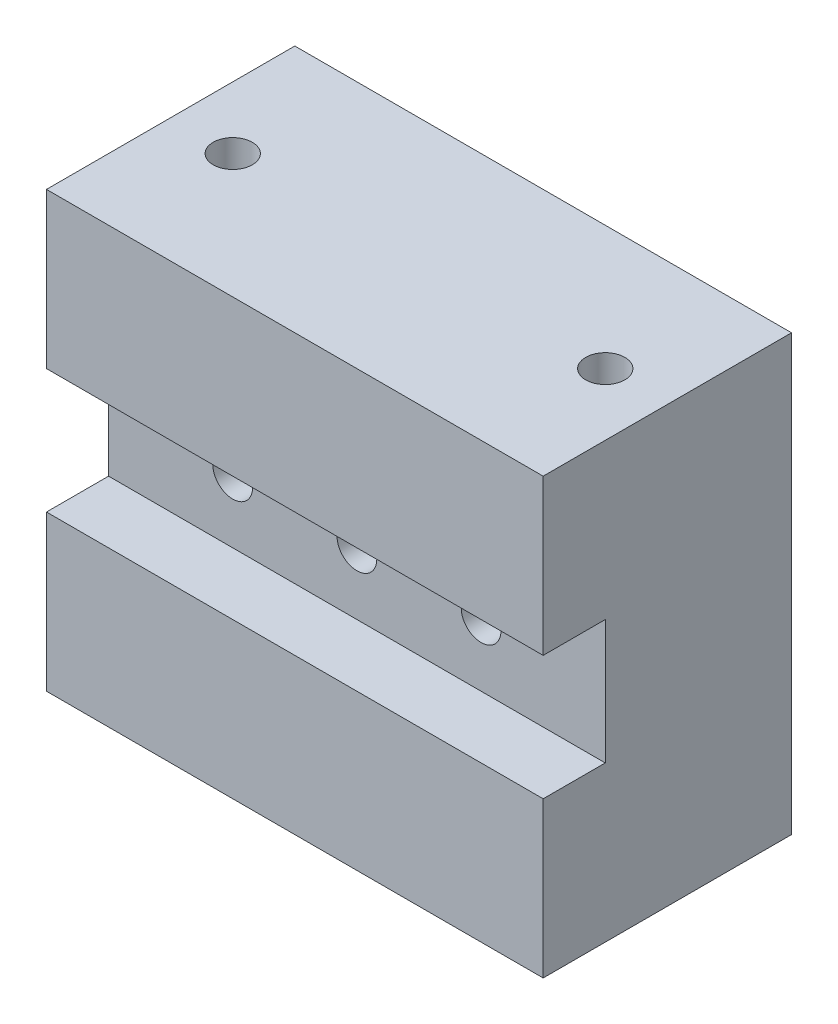
ISO-10303-21;
HEADER;
FILE_DESCRIPTION(('STEP AP214'),'2;1');
FILE_NAME('part.step','',(''),(''),'','','');
FILE_SCHEMA(('AUTOMOTIVE_DESIGN { 1 0 10303 214 1 1 1 1 }'));
ENDSEC;
DATA;
#1=APPLICATION_CONTEXT('core data for automotive mechanical design processes');
#2=APPLICATION_PROTOCOL_DEFINITION('international standard','automotive_design',2000,#1);
#3=PRODUCT_CONTEXT('',#1,'mechanical');
#4=PRODUCT('Part','Part','',(#3));
#5=PRODUCT_RELATED_PRODUCT_CATEGORY('part','',(#4));
#6=PRODUCT_DEFINITION_FORMATION('','',#4);
#7=PRODUCT_DEFINITION_CONTEXT('part definition',#1,'design');
#8=PRODUCT_DEFINITION('design','',#6,#7);
#9=PRODUCT_DEFINITION_SHAPE('','',#8);
#10=(LENGTH_UNIT() NAMED_UNIT(*) SI_UNIT(.MILLI.,.METRE.));
#11=(NAMED_UNIT(*) PLANE_ANGLE_UNIT() SI_UNIT($,.RADIAN.));
#12=(NAMED_UNIT(*) SI_UNIT($,.STERADIAN.) SOLID_ANGLE_UNIT());
#13=UNCERTAINTY_MEASURE_WITH_UNIT(LENGTH_MEASURE(1.E-05),#10,'distance_accuracy_value','');
#14=(GEOMETRIC_REPRESENTATION_CONTEXT(3) GLOBAL_UNCERTAINTY_ASSIGNED_CONTEXT((#13)) GLOBAL_UNIT_ASSIGNED_CONTEXT((#10,
#11,#12)) REPRESENTATION_CONTEXT('',''));
#15=CARTESIAN_POINT('',(0.,0.,0.));
#16=DIRECTION('',(0.,0.,1.));
#17=DIRECTION('',(1.,0.,0.));
#18=AXIS2_PLACEMENT_3D('',#15,#16,#17);
#19=CARTESIAN_POINT('',(0.,0.,25.4));
#20=DIRECTION('',(0.,0.,-1.));
#21=DIRECTION('',(-1.,0.,0.));
#22=AXIS2_PLACEMENT_3D('',#19,#20,#21);
#23=PLANE('',#22);
#24=DIRECTION('',(0.,-1.,0.));
#25=VECTOR('',#24,1.);
#26=CARTESIAN_POINT('',(0.,0.,25.4));
#27=LINE('',#26,#25);
#28=CARTESIAN_POINT('',(0.,44.45,25.4));
#29=VERTEX_POINT('',#28);
#30=CARTESIAN_POINT('',(0.,28.575,25.4));
#31=VERTEX_POINT('',#30);
#32=EDGE_CURVE('E148',#29,#31,#27,.T.);
#33=ORIENTED_EDGE('',*,*,#32,.T.);
#34=DIRECTION('',(-1.,0.,0.));
#35=VECTOR('',#34,1.);
#36=CARTESIAN_POINT('',(0.,28.575,25.4));
#37=LINE('',#36,#35);
#38=CARTESIAN_POINT('',(50.8,28.575,25.4));
#39=VERTEX_POINT('',#38);
#40=EDGE_CURVE('E125',#39,#31,#37,.T.);
#41=ORIENTED_EDGE('',*,*,#40,.F.);
#42=DIRECTION('',(0.,1.,0.));
#43=VECTOR('',#42,1.);
#44=CARTESIAN_POINT('',(50.8,0.,25.4));
#45=LINE('',#44,#43);
#46=CARTESIAN_POINT('',(50.8,44.45,25.4));
#47=VERTEX_POINT('',#46);
#48=EDGE_CURVE('E152',#39,#47,#45,.T.);
#49=ORIENTED_EDGE('',*,*,#48,.T.);
#50=DIRECTION('',(-1.,0.,0.));
#51=VECTOR('',#50,1.);
#52=CARTESIAN_POINT('',(0.,44.45,25.4));
#53=LINE('',#52,#51);
#54=EDGE_CURVE('E59',#47,#29,#53,.T.);
#55=ORIENTED_EDGE('',*,*,#54,.T.);
#56=EDGE_LOOP('',(#33,#41,#49,#55));
#57=FACE_BOUND('',#56,.T.);
#58=ADVANCED_FACE('F35',(#57),#23,.F.);
#59=CARTESIAN_POINT('',(0.,0.,25.4));
#60=DIRECTION('',(1.,0.,0.));
#61=DIRECTION('',(0.,0.,-1.));
#62=AXIS2_PLACEMENT_3D('',#59,#60,#61);
#63=PLANE('',#62);
#64=DIRECTION('',(0.,-1.,0.));
#65=VECTOR('',#64,1.);
#66=CARTESIAN_POINT('',(0.,15.875,19.05));
#67=LINE('',#66,#65);
#68=CARTESIAN_POINT('',(0.,28.575,19.05));
#69=VERTEX_POINT('',#68);
#70=CARTESIAN_POINT('',(0.,15.875,19.05));
#71=VERTEX_POINT('',#70);
#72=EDGE_CURVE('E116',#69,#71,#67,.T.);
#73=ORIENTED_EDGE('',*,*,#72,.F.);
#74=DIRECTION('',(0.,0.,1.));
#75=VECTOR('',#74,1.);
#76=CARTESIAN_POINT('',(0.,28.575,19.05));
#77=LINE('',#76,#75);
#78=EDGE_CURVE('E147',#69,#31,#77,.T.);
#79=ORIENTED_EDGE('',*,*,#78,.T.);
#80=ORIENTED_EDGE('',*,*,#32,.F.);
#81=DIRECTION('',(0.,0.,-1.));
#82=VECTOR('',#81,1.);
#83=CARTESIAN_POINT('',(0.,44.45,25.4));
#84=LINE('',#83,#82);
#85=CARTESIAN_POINT('',(0.,44.45,0.));
#86=VERTEX_POINT('',#85);
#87=EDGE_CURVE('E157',#29,#86,#84,.T.);
#88=ORIENTED_EDGE('',*,*,#87,.T.);
#89=DIRECTION('',(0.,-1.,0.));
#90=VECTOR('',#89,1.);
#91=CARTESIAN_POINT('',(0.,0.,0.));
#92=LINE('',#91,#90);
#93=CARTESIAN_POINT('',(0.,0.,0.));
#94=VERTEX_POINT('',#93);
#95=EDGE_CURVE('E137',#86,#94,#92,.T.);
#96=ORIENTED_EDGE('',*,*,#95,.T.);
#97=DIRECTION('',(0.,0.,-1.));
#98=VECTOR('',#97,1.);
#99=CARTESIAN_POINT('',(0.,0.,25.4));
#100=LINE('',#99,#98);
#101=CARTESIAN_POINT('',(0.,0.,25.4));
#102=VERTEX_POINT('',#101);
#103=EDGE_CURVE('E11',#102,#94,#100,.T.);
#104=ORIENTED_EDGE('',*,*,#103,.F.);
#105=CARTESIAN_POINT('',(0.,15.875,25.4));
#106=VERTEX_POINT('',#105);
#107=EDGE_CURVE('E87',#106,#102,#27,.T.);
#108=ORIENTED_EDGE('',*,*,#107,.F.);
#109=DIRECTION('',(0.,0.,1.));
#110=VECTOR('',#109,1.);
#111=CARTESIAN_POINT('',(0.,15.875,19.05));
#112=LINE('',#111,#110);
#113=EDGE_CURVE('E50',#71,#106,#112,.T.);
#114=ORIENTED_EDGE('',*,*,#113,.F.);
#115=EDGE_LOOP('',(#73,#79,#80,#88,#96,#104,#108,#114));
#116=FACE_BOUND('',#115,.T.);
#117=ADVANCED_FACE('F37',(#116),#63,.F.);
#118=CARTESIAN_POINT('',(0.,0.,25.4));
#119=DIRECTION('',(0.,1.,0.));
#120=DIRECTION('',(0.,0.,1.));
#121=AXIS2_PLACEMENT_3D('',#118,#119,#120);
#122=PLANE('',#121);
#123=CARTESIAN_POINT('',(6.35,0.,12.7));
#124=DIRECTION('',(0.,1.,0.));
#125=DIRECTION('',(0.,0.,1.));
#126=AXIS2_PLACEMENT_3D('',#123,#124,#125);
#127=CIRCLE('',#126,2.);
#128=CARTESIAN_POINT('',(6.35,0.,14.7));
#129=VERTEX_POINT('',#128);
#130=EDGE_CURVE('E134',#129,#129,#127,.T.);
#131=ORIENTED_EDGE('',*,*,#130,.T.);
#132=EDGE_LOOP('',(#131));
#133=FACE_BOUND('',#132,.T.);
#134=CARTESIAN_POINT('',(44.45,0.,12.7));
#135=DIRECTION('',(0.,1.,0.));
#136=DIRECTION('',(0.,0.,1.));
#137=AXIS2_PLACEMENT_3D('',#134,#135,#136);
#138=CIRCLE('',#137,2.);
#139=CARTESIAN_POINT('',(44.45,0.,14.7));
#140=VERTEX_POINT('',#139);
#141=EDGE_CURVE('E141',#140,#140,#138,.T.);
#142=ORIENTED_EDGE('',*,*,#141,.T.);
#143=EDGE_LOOP('',(#142));
#144=FACE_BOUND('',#143,.T.);
#145=DIRECTION('',(1.,0.,0.));
#146=VECTOR('',#145,1.);
#147=CARTESIAN_POINT('',(0.,0.,0.));
#148=LINE('',#147,#146);
#149=CARTESIAN_POINT('',(50.8,0.,0.));
#150=VERTEX_POINT('',#149);
#151=EDGE_CURVE('E160',#94,#150,#148,.T.);
#152=ORIENTED_EDGE('',*,*,#151,.T.);
#153=DIRECTION('',(0.,0.,-1.));
#154=VECTOR('',#153,1.);
#155=CARTESIAN_POINT('',(50.8,0.,25.4));
#156=LINE('',#155,#154);
#157=CARTESIAN_POINT('',(50.8,0.,25.4));
#158=VERTEX_POINT('',#157);
#159=EDGE_CURVE('E43',#158,#150,#156,.T.);
#160=ORIENTED_EDGE('',*,*,#159,.F.);
#161=DIRECTION('',(1.,0.,0.));
#162=VECTOR('',#161,1.);
#163=CARTESIAN_POINT('',(0.,0.,25.4));
#164=LINE('',#163,#162);
#165=EDGE_CURVE('E150',#102,#158,#164,.T.);
#166=ORIENTED_EDGE('',*,*,#165,.F.);
#167=ORIENTED_EDGE('',*,*,#103,.T.);
#168=EDGE_LOOP('',(#152,#160,#166,#167));
#169=FACE_BOUND('',#168,.T.);
#170=ADVANCED_FACE('F208',(#133,#144,#169),#122,.F.);
#171=CARTESIAN_POINT('',(50.8,0.,25.4));
#172=DIRECTION('',(-1.,0.,0.));
#173=DIRECTION('',(0.,0.,1.));
#174=AXIS2_PLACEMENT_3D('',#171,#172,#173);
#175=PLANE('',#174);
#176=ORIENTED_EDGE('',*,*,#48,.F.);
#177=DIRECTION('',(0.,0.,1.));
#178=VECTOR('',#177,1.);
#179=CARTESIAN_POINT('',(50.8,28.575,19.05));
#180=LINE('',#179,#178);
#181=CARTESIAN_POINT('',(50.8,28.575,19.05));
#182=VERTEX_POINT('',#181);
#183=EDGE_CURVE('E129',#182,#39,#180,.T.);
#184=ORIENTED_EDGE('',*,*,#183,.F.);
#185=DIRECTION('',(0.,1.,0.));
#186=VECTOR('',#185,1.);
#187=CARTESIAN_POINT('',(50.8,15.875,19.05));
#188=LINE('',#187,#186);
#189=CARTESIAN_POINT('',(50.8,15.875,19.05));
#190=VERTEX_POINT('',#189);
#191=EDGE_CURVE('E115',#190,#182,#188,.T.);
#192=ORIENTED_EDGE('',*,*,#191,.F.);
#193=DIRECTION('',(0.,0.,1.));
#194=VECTOR('',#193,1.);
#195=CARTESIAN_POINT('',(50.8,15.875,19.05));
#196=LINE('',#195,#194);
#197=CARTESIAN_POINT('',(50.8,15.875,25.4));
#198=VERTEX_POINT('',#197);
#199=EDGE_CURVE('E112',#190,#198,#196,.T.);
#200=ORIENTED_EDGE('',*,*,#199,.T.);
#201=EDGE_CURVE('E153',#158,#198,#45,.T.);
#202=ORIENTED_EDGE('',*,*,#201,.F.);
#203=ORIENTED_EDGE('',*,*,#159,.T.);
#204=DIRECTION('',(0.,1.,0.));
#205=VECTOR('',#204,1.);
#206=CARTESIAN_POINT('',(50.8,0.,0.));
#207=LINE('',#206,#205);
#208=CARTESIAN_POINT('',(50.8,44.45,0.));
#209=VERTEX_POINT('',#208);
#210=EDGE_CURVE('E162',#150,#209,#207,.T.);
#211=ORIENTED_EDGE('',*,*,#210,.T.);
#212=DIRECTION('',(0.,0.,-1.));
#213=VECTOR('',#212,1.);
#214=CARTESIAN_POINT('',(50.8,44.45,25.4));
#215=LINE('',#214,#213);
#216=EDGE_CURVE('E166',#47,#209,#215,.T.);
#217=ORIENTED_EDGE('',*,*,#216,.F.);
#218=EDGE_LOOP('',(#176,#184,#192,#200,#202,#203,#211,#217));
#219=FACE_BOUND('',#218,.T.);
#220=ADVANCED_FACE('F173',(#219),#175,.F.);
#221=CARTESIAN_POINT('',(0.,44.45,25.4));
#222=DIRECTION('',(0.,-1.,0.));
#223=DIRECTION('',(0.,0.,-1.));
#224=AXIS2_PLACEMENT_3D('',#221,#222,#223);
#225=PLANE('',#224);
#226=CARTESIAN_POINT('',(6.35,44.45,12.7));
#227=DIRECTION('',(0.,1.,0.));
#228=DIRECTION('',(0.,0.,1.));
#229=AXIS2_PLACEMENT_3D('',#226,#227,#228);
#230=CIRCLE('',#229,2.);
#231=CARTESIAN_POINT('',(6.35,44.45,14.7));
#232=VERTEX_POINT('',#231);
#233=EDGE_CURVE('E138',#232,#232,#230,.T.);
#234=ORIENTED_EDGE('',*,*,#233,.F.);
#235=EDGE_LOOP('',(#234));
#236=FACE_BOUND('',#235,.T.);
#237=CARTESIAN_POINT('',(44.45,44.45,12.7));
#238=DIRECTION('',(0.,1.,0.));
#239=DIRECTION('',(0.,0.,1.));
#240=AXIS2_PLACEMENT_3D('',#237,#238,#239);
#241=CIRCLE('',#240,2.);
#242=CARTESIAN_POINT('',(44.45,44.45,14.7));
#243=VERTEX_POINT('',#242);
#244=EDGE_CURVE('E144',#243,#243,#241,.T.);
#245=ORIENTED_EDGE('',*,*,#244,.F.);
#246=EDGE_LOOP('',(#245));
#247=FACE_BOUND('',#246,.T.);
#248=DIRECTION('',(-1.,0.,0.));
#249=VECTOR('',#248,1.);
#250=CARTESIAN_POINT('',(0.,44.45,0.));
#251=LINE('',#250,#249);
#252=EDGE_CURVE('E80',#209,#86,#251,.T.);
#253=ORIENTED_EDGE('',*,*,#252,.T.);
#254=ORIENTED_EDGE('',*,*,#87,.F.);
#255=ORIENTED_EDGE('',*,*,#54,.F.);
#256=ORIENTED_EDGE('',*,*,#216,.T.);
#257=EDGE_LOOP('',(#253,#254,#255,#256));
#258=FACE_BOUND('',#257,.T.);
#259=ADVANCED_FACE('F180',(#236,#247,#258),#225,.F.);
#260=ORIENTED_EDGE('',*,*,#201,.T.);
#261=DIRECTION('',(1.,0.,0.));
#262=VECTOR('',#261,1.);
#263=CARTESIAN_POINT('',(0.,15.875,25.4));
#264=LINE('',#263,#262);
#265=EDGE_CURVE('E184',#106,#198,#264,.T.);
#266=ORIENTED_EDGE('',*,*,#265,.F.);
#267=ORIENTED_EDGE('',*,*,#107,.T.);
#268=ORIENTED_EDGE('',*,*,#165,.T.);
#269=EDGE_LOOP('',(#260,#266,#267,#268));
#270=FACE_BOUND('',#269,.T.);
#271=ADVANCED_FACE('F204',(#270),#23,.F.);
#272=CARTESIAN_POINT('',(0.,0.,0.));
#273=DIRECTION('',(0.,0.,-1.));
#274=DIRECTION('',(-1.,0.,0.));
#275=AXIS2_PLACEMENT_3D('',#272,#273,#274);
#276=PLANE('',#275);
#277=CARTESIAN_POINT('',(12.7,22.225,0.));
#278=DIRECTION('',(0.,0.,1.));
#279=DIRECTION('',(1.,0.,0.));
#280=AXIS2_PLACEMENT_3D('',#277,#278,#279);
#281=CIRCLE('',#280,2.032);
#282=CARTESIAN_POINT('',(14.732,22.225,0.));
#283=VERTEX_POINT('',#282);
#284=EDGE_CURVE('E323',#283,#283,#281,.T.);
#285=ORIENTED_EDGE('',*,*,#284,.T.);
#286=EDGE_LOOP('',(#285));
#287=FACE_BOUND('',#286,.T.);
#288=CARTESIAN_POINT('',(38.1,22.225,0.));
#289=DIRECTION('',(0.,0.,1.));
#290=DIRECTION('',(1.,0.,0.));
#291=AXIS2_PLACEMENT_3D('',#288,#289,#290);
#292=CIRCLE('',#291,2.032);
#293=CARTESIAN_POINT('',(40.132,22.225,0.));
#294=VERTEX_POINT('',#293);
#295=EDGE_CURVE('E336',#294,#294,#292,.T.);
#296=ORIENTED_EDGE('',*,*,#295,.T.);
#297=EDGE_LOOP('',(#296));
#298=FACE_BOUND('',#297,.T.);
#299=CARTESIAN_POINT('',(25.4,22.225,0.));
#300=DIRECTION('',(0.,0.,1.));
#301=DIRECTION('',(1.,0.,0.));
#302=AXIS2_PLACEMENT_3D('',#299,#300,#301);
#303=CIRCLE('',#302,2.032);
#304=CARTESIAN_POINT('',(27.432,22.225,0.));
#305=VERTEX_POINT('',#304);
#306=EDGE_CURVE('E186',#305,#305,#303,.T.);
#307=ORIENTED_EDGE('',*,*,#306,.T.);
#308=EDGE_LOOP('',(#307));
#309=FACE_BOUND('',#308,.T.);
#310=ORIENTED_EDGE('',*,*,#95,.F.);
#311=ORIENTED_EDGE('',*,*,#252,.F.);
#312=ORIENTED_EDGE('',*,*,#210,.F.);
#313=ORIENTED_EDGE('',*,*,#151,.F.);
#314=EDGE_LOOP('',(#310,#311,#312,#313));
#315=FACE_BOUND('',#314,.T.);
#316=ADVANCED_FACE('F178',(#287,#298,#309,#315),#276,.T.);
#317=CARTESIAN_POINT('',(44.45,0.,12.7));
#318=DIRECTION('',(0.,1.,0.));
#319=DIRECTION('',(0.,0.,1.));
#320=AXIS2_PLACEMENT_3D('',#317,#318,#319);
#321=CYLINDRICAL_SURFACE('',#320,2.);
#322=ORIENTED_EDGE('',*,*,#141,.F.);
#323=EDGE_LOOP('',(#322));
#324=FACE_BOUND('',#323,.T.);
#325=ORIENTED_EDGE('',*,*,#244,.T.);
#326=EDGE_LOOP('',(#325));
#327=FACE_BOUND('',#326,.T.);
#328=ADVANCED_FACE('F198',(#324,#327),#321,.F.);
#329=CARTESIAN_POINT('',(6.35,0.,12.7));
#330=DIRECTION('',(0.,1.,0.));
#331=DIRECTION('',(0.,0.,1.));
#332=AXIS2_PLACEMENT_3D('',#329,#330,#331);
#333=CYLINDRICAL_SURFACE('',#332,2.);
#334=ORIENTED_EDGE('',*,*,#130,.F.);
#335=EDGE_LOOP('',(#334));
#336=FACE_BOUND('',#335,.T.);
#337=ORIENTED_EDGE('',*,*,#233,.T.);
#338=EDGE_LOOP('',(#337));
#339=FACE_BOUND('',#338,.T.);
#340=ADVANCED_FACE('F191',(#336,#339),#333,.F.);
#341=CARTESIAN_POINT('',(0.,28.575,19.05));
#342=DIRECTION('',(0.,1.,0.));
#343=DIRECTION('',(0.,0.,1.));
#344=AXIS2_PLACEMENT_3D('',#341,#342,#343);
#345=PLANE('',#344);
#346=ORIENTED_EDGE('',*,*,#40,.T.);
#347=ORIENTED_EDGE('',*,*,#78,.F.);
#348=DIRECTION('',(-1.,0.,0.));
#349=VECTOR('',#348,1.);
#350=CARTESIAN_POINT('',(0.,28.575,19.05));
#351=LINE('',#350,#349);
#352=EDGE_CURVE('E122',#182,#69,#351,.T.);
#353=ORIENTED_EDGE('',*,*,#352,.F.);
#354=ORIENTED_EDGE('',*,*,#183,.T.);
#355=EDGE_LOOP('',(#346,#347,#353,#354));
#356=FACE_BOUND('',#355,.T.);
#357=ADVANCED_FACE('F189',(#356),#345,.F.);
#358=CARTESIAN_POINT('',(0.,15.875,19.05));
#359=DIRECTION('',(0.,-1.,0.));
#360=DIRECTION('',(0.,0.,-1.));
#361=AXIS2_PLACEMENT_3D('',#358,#359,#360);
#362=PLANE('',#361);
#363=ORIENTED_EDGE('',*,*,#265,.T.);
#364=ORIENTED_EDGE('',*,*,#199,.F.);
#365=DIRECTION('',(1.,0.,0.));
#366=VECTOR('',#365,1.);
#367=CARTESIAN_POINT('',(0.,15.875,19.05));
#368=LINE('',#367,#366);
#369=EDGE_CURVE('E108',#71,#190,#368,.T.);
#370=ORIENTED_EDGE('',*,*,#369,.F.);
#371=ORIENTED_EDGE('',*,*,#113,.T.);
#372=EDGE_LOOP('',(#363,#364,#370,#371));
#373=FACE_BOUND('',#372,.T.);
#374=ADVANCED_FACE('F110',(#373),#362,.F.);
#375=CARTESIAN_POINT('',(0.,0.,19.05));
#376=DIRECTION('',(0.,0.,-1.));
#377=DIRECTION('',(-1.,0.,0.));
#378=AXIS2_PLACEMENT_3D('',#375,#376,#377);
#379=PLANE('',#378);
#380=CARTESIAN_POINT('',(12.7,22.225,19.05));
#381=DIRECTION('',(0.,0.,1.));
#382=DIRECTION('',(1.,0.,0.));
#383=AXIS2_PLACEMENT_3D('',#380,#381,#382);
#384=CIRCLE('',#383,2.032);
#385=CARTESIAN_POINT('',(14.732,22.225,19.05));
#386=VERTEX_POINT('',#385);
#387=EDGE_CURVE('E326',#386,#386,#384,.T.);
#388=ORIENTED_EDGE('',*,*,#387,.F.);
#389=EDGE_LOOP('',(#388));
#390=FACE_BOUND('',#389,.T.);
#391=CARTESIAN_POINT('',(38.1,22.225,19.05));
#392=DIRECTION('',(0.,0.,1.));
#393=DIRECTION('',(1.,0.,0.));
#394=AXIS2_PLACEMENT_3D('',#391,#392,#393);
#395=CIRCLE('',#394,2.032);
#396=CARTESIAN_POINT('',(40.132,22.225,19.05));
#397=VERTEX_POINT('',#396);
#398=EDGE_CURVE('E328',#397,#397,#395,.T.);
#399=ORIENTED_EDGE('',*,*,#398,.F.);
#400=EDGE_LOOP('',(#399));
#401=FACE_BOUND('',#400,.T.);
#402=CARTESIAN_POINT('',(25.4,22.225,19.05));
#403=DIRECTION('',(0.,0.,1.));
#404=DIRECTION('',(1.,0.,0.));
#405=AXIS2_PLACEMENT_3D('',#402,#403,#404);
#406=CIRCLE('',#405,2.032);
#407=CARTESIAN_POINT('',(27.432,22.225,19.05));
#408=VERTEX_POINT('',#407);
#409=EDGE_CURVE('E334',#408,#408,#406,.T.);
#410=ORIENTED_EDGE('',*,*,#409,.F.);
#411=EDGE_LOOP('',(#410));
#412=FACE_BOUND('',#411,.T.);
#413=ORIENTED_EDGE('',*,*,#72,.T.);
#414=ORIENTED_EDGE('',*,*,#369,.T.);
#415=ORIENTED_EDGE('',*,*,#191,.T.);
#416=ORIENTED_EDGE('',*,*,#352,.T.);
#417=EDGE_LOOP('',(#413,#414,#415,#416));
#418=FACE_BOUND('',#417,.T.);
#419=ADVANCED_FACE('F120',(#390,#401,#412,#418),#379,.F.);
#420=CARTESIAN_POINT('',(25.4,22.225,0.));
#421=DIRECTION('',(0.,0.,1.));
#422=DIRECTION('',(1.,0.,0.));
#423=AXIS2_PLACEMENT_3D('',#420,#421,#422);
#424=CYLINDRICAL_SURFACE('',#423,2.032);
#425=ORIENTED_EDGE('',*,*,#306,.F.);
#426=EDGE_LOOP('',(#425));
#427=FACE_BOUND('',#426,.T.);
#428=ORIENTED_EDGE('',*,*,#409,.T.);
#429=EDGE_LOOP('',(#428));
#430=FACE_BOUND('',#429,.T.);
#431=ADVANCED_FACE('F287',(#427,#430),#424,.F.);
#432=CARTESIAN_POINT('',(38.1,22.225,0.));
#433=DIRECTION('',(0.,0.,1.));
#434=DIRECTION('',(1.,0.,0.));
#435=AXIS2_PLACEMENT_3D('',#432,#433,#434);
#436=CYLINDRICAL_SURFACE('',#435,2.032);
#437=ORIENTED_EDGE('',*,*,#295,.F.);
#438=EDGE_LOOP('',(#437));
#439=FACE_BOUND('',#438,.T.);
#440=ORIENTED_EDGE('',*,*,#398,.T.);
#441=EDGE_LOOP('',(#440));
#442=FACE_BOUND('',#441,.T.);
#443=ADVANCED_FACE('F296',(#439,#442),#436,.F.);
#444=CARTESIAN_POINT('',(12.7,22.225,0.));
#445=DIRECTION('',(0.,0.,1.));
#446=DIRECTION('',(1.,0.,0.));
#447=AXIS2_PLACEMENT_3D('',#444,#445,#446);
#448=CYLINDRICAL_SURFACE('',#447,2.032);
#449=ORIENTED_EDGE('',*,*,#284,.F.);
#450=EDGE_LOOP('',(#449));
#451=FACE_BOUND('',#450,.T.);
#452=ORIENTED_EDGE('',*,*,#387,.T.);
#453=EDGE_LOOP('',(#452));
#454=FACE_BOUND('',#453,.T.);
#455=ADVANCED_FACE('F306',(#451,#454),#448,.F.);
#456=CLOSED_SHELL('',(#58,#117,#170,#220,#259,#271,#316,#328,#340,#357,#374,#419,#431,#443,#455));
#457=MANIFOLD_SOLID_BREP('B2',#456);
#458=ADVANCED_BREP_SHAPE_REPRESENTATION('',(#18,#457),#14);
#459=SHAPE_DEFINITION_REPRESENTATION(#9,#458);
ENDSEC;
END-ISO-10303-21;
